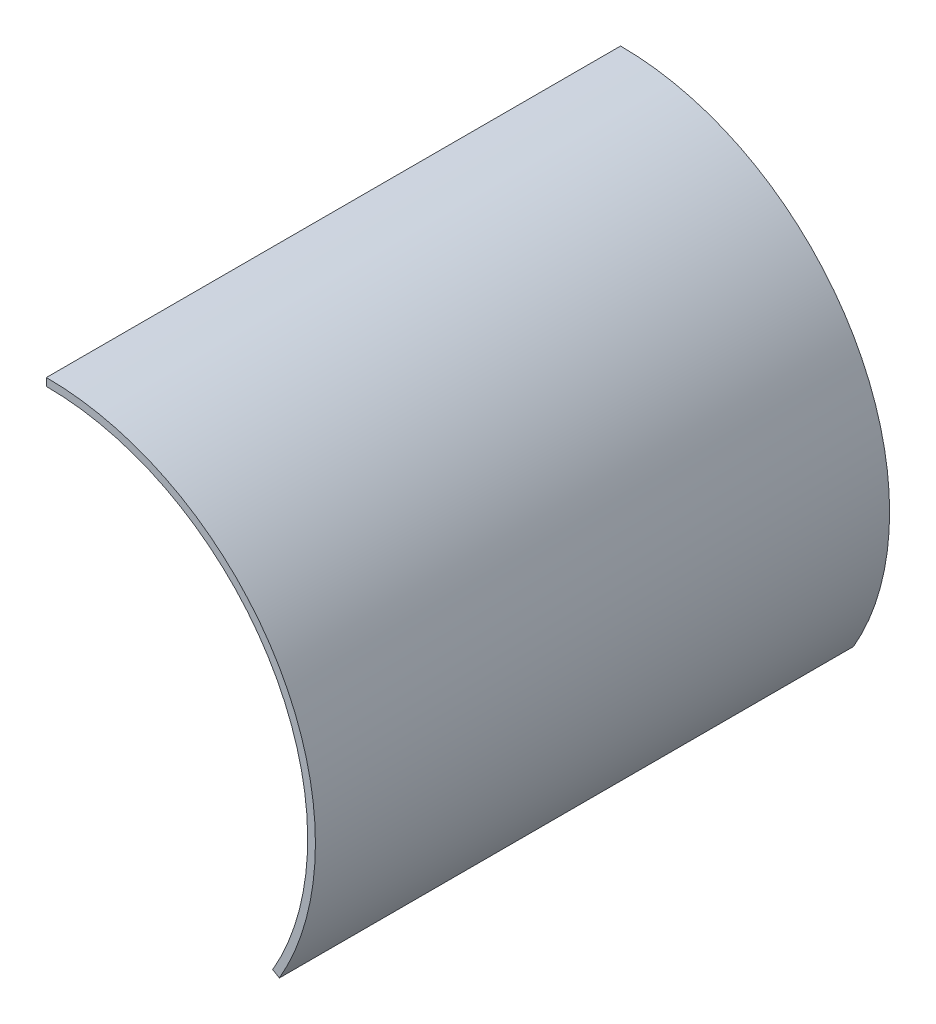
ISO-10303-21;
HEADER;
FILE_DESCRIPTION(('STEP AP214'),'2;1');
FILE_NAME('part.step','',(''),(''),'','','');
FILE_SCHEMA(('AUTOMOTIVE_DESIGN { 1 0 10303 214 1 1 1 1 }'));
ENDSEC;
DATA;
#1=APPLICATION_CONTEXT('core data for automotive mechanical design processes');
#2=APPLICATION_PROTOCOL_DEFINITION('international standard','automotive_design',2000,#1);
#3=PRODUCT_CONTEXT('',#1,'mechanical');
#4=PRODUCT('Part','Part','',(#3));
#5=PRODUCT_RELATED_PRODUCT_CATEGORY('part','',(#4));
#6=PRODUCT_DEFINITION_FORMATION('','',#4);
#7=PRODUCT_DEFINITION_CONTEXT('part definition',#1,'design');
#8=PRODUCT_DEFINITION('design','',#6,#7);
#9=PRODUCT_DEFINITION_SHAPE('','',#8);
#10=(LENGTH_UNIT() NAMED_UNIT(*) SI_UNIT(.MILLI.,.METRE.));
#11=(NAMED_UNIT(*) PLANE_ANGLE_UNIT() SI_UNIT($,.RADIAN.));
#12=(NAMED_UNIT(*) SI_UNIT($,.STERADIAN.) SOLID_ANGLE_UNIT());
#13=UNCERTAINTY_MEASURE_WITH_UNIT(LENGTH_MEASURE(1.E-05),#10,'distance_accuracy_value','');
#14=(GEOMETRIC_REPRESENTATION_CONTEXT(3) GLOBAL_UNCERTAINTY_ASSIGNED_CONTEXT((#13)) GLOBAL_UNIT_ASSIGNED_CONTEXT((#10,
#11,#12)) REPRESENTATION_CONTEXT('',''));
#15=CARTESIAN_POINT('',(0.,0.,0.));
#16=DIRECTION('',(0.,0.,1.));
#17=DIRECTION('',(1.,0.,0.));
#18=AXIS2_PLACEMENT_3D('',#15,#16,#17);
#19=CARTESIAN_POINT('',(0.,0.,0.));
#20=DIRECTION('',(0.,0.,1.));
#21=DIRECTION('',(1.,0.,0.));
#22=AXIS2_PLACEMENT_3D('',#19,#20,#21);
#23=CYLINDRICAL_SURFACE('',#22,41.7);
#24=CARTESIAN_POINT('',(0.,0.,0.));
#25=DIRECTION('',(0.,0.,1.));
#26=DIRECTION('',(1.,0.,0.));
#27=AXIS2_PLACEMENT_3D('',#24,#25,#26);
#28=CIRCLE('',#27,41.7);
#29=CARTESIAN_POINT('',(36.113259337811,-20.8500000000002,0.));
#30=VERTEX_POINT('',#29);
#31=CARTESIAN_POINT('',(0.,41.7,0.));
#32=VERTEX_POINT('',#31);
#33=EDGE_CURVE('E11',#30,#32,#28,.T.);
#34=ORIENTED_EDGE('',*,*,#33,.F.);
#35=DIRECTION('',(0.,0.,1.));
#36=VECTOR('',#35,1.);
#37=CARTESIAN_POINT('',(36.113259337811,-20.8500000000002,-89.));
#38=LINE('',#37,#36);
#39=CARTESIAN_POINT('',(36.113259337811,-20.8500000000002,-89.));
#40=VERTEX_POINT('',#39);
#41=EDGE_CURVE('E95',#40,#30,#38,.T.);
#42=ORIENTED_EDGE('',*,*,#41,.F.);
#43=CARTESIAN_POINT('',(0.,0.,-89.));
#44=DIRECTION('',(0.,0.,1.));
#45=DIRECTION('',(1.,0.,0.));
#46=AXIS2_PLACEMENT_3D('',#43,#44,#45);
#47=CIRCLE('',#46,41.7);
#48=CARTESIAN_POINT('',(0.,41.7,-89.));
#49=VERTEX_POINT('',#48);
#50=EDGE_CURVE('E48',#40,#49,#47,.T.);
#51=ORIENTED_EDGE('',*,*,#50,.T.);
#52=DIRECTION('',(0.,0.,1.));
#53=VECTOR('',#52,1.);
#54=CARTESIAN_POINT('',(0.,41.7,-89.));
#55=LINE('',#54,#53);
#56=EDGE_CURVE('E84',#49,#32,#55,.T.);
#57=ORIENTED_EDGE('',*,*,#56,.T.);
#58=EDGE_LOOP('',(#34,#42,#51,#57));
#59=FACE_BOUND('',#58,.T.);
#60=ADVANCED_FACE('F33',(#59),#23,.T.);
#61=CARTESIAN_POINT('',(36.113259337811,-20.8500000000002,0.));
#62=DIRECTION('',(0.,0.,-1.));
#63=DIRECTION('',(-1.,0.,0.));
#64=AXIS2_PLACEMENT_3D('',#61,#62,#63);
#65=PLANE('',#64);
#66=CARTESIAN_POINT('',(0.,0.,0.));
#67=DIRECTION('',(0.,0.,1.));
#68=DIRECTION('',(1.,0.,0.));
#69=AXIS2_PLACEMENT_3D('',#66,#67,#68);
#70=CIRCLE('',#69,40.5);
#71=CARTESIAN_POINT('',(35.0740288532697,-20.2500000000002,0.));
#72=VERTEX_POINT('',#71);
#73=CARTESIAN_POINT('',(0.,40.5,0.));
#74=VERTEX_POINT('',#73);
#75=EDGE_CURVE('E41',#72,#74,#70,.T.);
#76=ORIENTED_EDGE('',*,*,#75,.F.);
#77=DIRECTION('',(-0.866025403784436,0.500000000000004,0.));
#78=VECTOR('',#77,1.);
#79=CARTESIAN_POINT('',(36.113259337811,-20.8500000000002,0.));
#80=LINE('',#79,#78);
#81=EDGE_CURVE('E80',#30,#72,#80,.T.);
#82=ORIENTED_EDGE('',*,*,#81,.F.);
#83=ORIENTED_EDGE('',*,*,#33,.T.);
#84=DIRECTION('',(0.,-1.,0.));
#85=VECTOR('',#84,1.);
#86=CARTESIAN_POINT('',(0.,41.7,0.));
#87=LINE('',#86,#85);
#88=EDGE_CURVE('E77',#32,#74,#87,.T.);
#89=ORIENTED_EDGE('',*,*,#88,.T.);
#90=EDGE_LOOP('',(#76,#82,#83,#89));
#91=FACE_BOUND('',#90,.T.);
#92=ADVANCED_FACE('F35',(#91),#65,.F.);
#93=CARTESIAN_POINT('',(0.,0.,0.));
#94=DIRECTION('',(0.,0.,1.));
#95=DIRECTION('',(1.,0.,0.));
#96=AXIS2_PLACEMENT_3D('',#93,#94,#95);
#97=CYLINDRICAL_SURFACE('',#96,40.5);
#98=CARTESIAN_POINT('',(0.,0.,-89.));
#99=DIRECTION('',(0.,0.,1.));
#100=DIRECTION('',(1.,0.,0.));
#101=AXIS2_PLACEMENT_3D('',#98,#99,#100);
#102=CIRCLE('',#101,40.5);
#103=CARTESIAN_POINT('',(35.0740288532697,-20.2500000000002,-89.));
#104=VERTEX_POINT('',#103);
#105=CARTESIAN_POINT('',(0.,40.5,-89.));
#106=VERTEX_POINT('',#105);
#107=EDGE_CURVE('E56',#104,#106,#102,.T.);
#108=ORIENTED_EDGE('',*,*,#107,.F.);
#109=DIRECTION('',(0.,0.,-1.));
#110=VECTOR('',#109,1.);
#111=CARTESIAN_POINT('',(35.0740288532697,-20.2500000000002,0.));
#112=LINE('',#111,#110);
#113=EDGE_CURVE('E98',#72,#104,#112,.T.);
#114=ORIENTED_EDGE('',*,*,#113,.F.);
#115=ORIENTED_EDGE('',*,*,#75,.T.);
#116=DIRECTION('',(0.,0.,-1.));
#117=VECTOR('',#116,1.);
#118=CARTESIAN_POINT('',(0.,40.5,0.));
#119=LINE('',#118,#117);
#120=EDGE_CURVE('E89',#74,#106,#119,.T.);
#121=ORIENTED_EDGE('',*,*,#120,.T.);
#122=EDGE_LOOP('',(#108,#114,#115,#121));
#123=FACE_BOUND('',#122,.T.);
#124=ADVANCED_FACE('F104',(#123),#97,.F.);
#125=CARTESIAN_POINT('',(35.0740288532697,-20.2500000000002,-89.));
#126=DIRECTION('',(0.,0.,1.));
#127=DIRECTION('',(1.,0.,0.));
#128=AXIS2_PLACEMENT_3D('',#125,#126,#127);
#129=PLANE('',#128);
#130=DIRECTION('',(0.866025403784436,-0.500000000000004,0.));
#131=VECTOR('',#130,1.);
#132=CARTESIAN_POINT('',(35.0740288532697,-20.2500000000002,-89.));
#133=LINE('',#132,#131);
#134=EDGE_CURVE('E100',#104,#40,#133,.T.);
#135=ORIENTED_EDGE('',*,*,#134,.F.);
#136=ORIENTED_EDGE('',*,*,#107,.T.);
#137=DIRECTION('',(0.,1.,0.));
#138=VECTOR('',#137,1.);
#139=CARTESIAN_POINT('',(0.,40.5,-89.));
#140=LINE('',#139,#138);
#141=EDGE_CURVE('E91',#106,#49,#140,.T.);
#142=ORIENTED_EDGE('',*,*,#141,.T.);
#143=ORIENTED_EDGE('',*,*,#50,.F.);
#144=EDGE_LOOP('',(#135,#136,#142,#143));
#145=FACE_BOUND('',#144,.T.);
#146=ADVANCED_FACE('F107',(#145),#129,.F.);
#147=CARTESIAN_POINT('',(0.,0.,0.));
#148=DIRECTION('',(-0.500000000000004,-0.866025403784436,0.));
#149=DIRECTION('',(0.,0.,-1.));
#150=AXIS2_PLACEMENT_3D('',#147,#148,#149);
#151=PLANE('',#150);
#152=ORIENTED_EDGE('',*,*,#41,.T.);
#153=ORIENTED_EDGE('',*,*,#81,.T.);
#154=ORIENTED_EDGE('',*,*,#113,.T.);
#155=ORIENTED_EDGE('',*,*,#134,.T.);
#156=EDGE_LOOP('',(#152,#153,#154,#155));
#157=FACE_BOUND('',#156,.T.);
#158=ADVANCED_FACE('F106',(#157),#151,.T.);
#159=CARTESIAN_POINT('',(0.,0.,0.));
#160=DIRECTION('',(1.,0.,0.));
#161=DIRECTION('',(0.,0.,-1.));
#162=AXIS2_PLACEMENT_3D('',#159,#160,#161);
#163=PLANE('',#162);
#164=ORIENTED_EDGE('',*,*,#56,.F.);
#165=ORIENTED_EDGE('',*,*,#141,.F.);
#166=ORIENTED_EDGE('',*,*,#120,.F.);
#167=ORIENTED_EDGE('',*,*,#88,.F.);
#168=EDGE_LOOP('',(#164,#165,#166,#167));
#169=FACE_BOUND('',#168,.T.);
#170=ADVANCED_FACE('F88',(#169),#163,.F.);
#171=CLOSED_SHELL('',(#60,#92,#124,#146,#158,#170));
#172=MANIFOLD_SOLID_BREP('B2',#171);
#173=ADVANCED_BREP_SHAPE_REPRESENTATION('',(#18,#172),#14);
#174=SHAPE_DEFINITION_REPRESENTATION(#9,#173);
ENDSEC;
END-ISO-10303-21;
